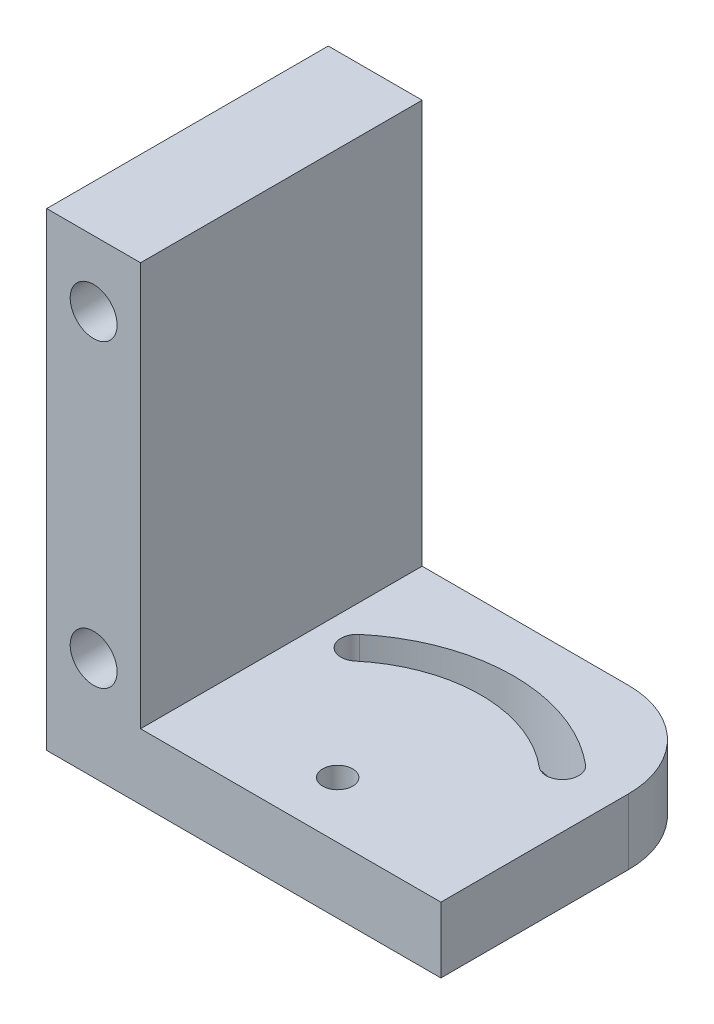
ISO-10303-21;
HEADER;
FILE_DESCRIPTION(('STEP AP214'),'2;1');
FILE_NAME('part.step','',(''),(''),'','','');
FILE_SCHEMA(('AUTOMOTIVE_DESIGN { 1 0 10303 214 1 1 1 1 }'));
ENDSEC;
DATA;
#1=APPLICATION_CONTEXT('core data for automotive mechanical design processes');
#2=APPLICATION_PROTOCOL_DEFINITION('international standard','automotive_design',2000,#1);
#3=PRODUCT_CONTEXT('',#1,'mechanical');
#4=PRODUCT('Part','Part','',(#3));
#5=PRODUCT_RELATED_PRODUCT_CATEGORY('part','',(#4));
#6=PRODUCT_DEFINITION_FORMATION('','',#4);
#7=PRODUCT_DEFINITION_CONTEXT('part definition',#1,'design');
#8=PRODUCT_DEFINITION('design','',#6,#7);
#9=PRODUCT_DEFINITION_SHAPE('','',#8);
#10=(LENGTH_UNIT() NAMED_UNIT(*) SI_UNIT(.MILLI.,.METRE.));
#11=(NAMED_UNIT(*) PLANE_ANGLE_UNIT() SI_UNIT($,.RADIAN.));
#12=(NAMED_UNIT(*) SI_UNIT($,.STERADIAN.) SOLID_ANGLE_UNIT());
#13=UNCERTAINTY_MEASURE_WITH_UNIT(LENGTH_MEASURE(1.E-05),#10,'distance_accuracy_value','');
#14=(GEOMETRIC_REPRESENTATION_CONTEXT(3) GLOBAL_UNCERTAINTY_ASSIGNED_CONTEXT((#13)) GLOBAL_UNIT_ASSIGNED_CONTEXT((#10,
#11,#12)) REPRESENTATION_CONTEXT('',''));
#15=CARTESIAN_POINT('',(0.,0.,0.));
#16=DIRECTION('',(0.,0.,1.));
#17=DIRECTION('',(1.,0.,0.));
#18=AXIS2_PLACEMENT_3D('',#15,#16,#17);
#19=CARTESIAN_POINT('',(0.,7.,0.));
#20=DIRECTION('',(0.,1.,0.));
#21=DIRECTION('',(0.,0.,1.));
#22=AXIS2_PLACEMENT_3D('',#19,#20,#21);
#23=PLANE('',#22);
#24=CARTESIAN_POINT('',(1.70652871400701,7.,15.1316701728416));
#25=DIRECTION('',(0.,1.,0.));
#26=DIRECTION('',(0.,0.,1.));
#27=AXIS2_PLACEMENT_3D('',#24,#25,#26);
#28=CIRCLE('',#27,1.6);
#29=CARTESIAN_POINT('',(1.70652871400701,7.,16.7316701728416));
#30=VERTEX_POINT('',#29);
#31=EDGE_CURVE('E172',#30,#30,#28,.T.);
#32=ORIENTED_EDGE('',*,*,#31,.F.);
#33=EDGE_LOOP('',(#32));
#34=FACE_BOUND('',#33,.T.);
#35=CARTESIAN_POINT('',(-9.22086065066418,7.,2.10891463981895));
#36=DIRECTION('',(0.,1.,0.));
#37=DIRECTION('',(0.,0.,1.));
#38=AXIS2_PLACEMENT_3D('',#35,#36,#37);
#39=CIRCLE('',#38,1.75);
#40=CARTESIAN_POINT('',(-10.3457389676156,7.,0.768336864360739));
#41=VERTEX_POINT('',#40);
#42=CARTESIAN_POINT('',(-8.09598233371273,7.,3.44949241527716));
#43=VERTEX_POINT('',#42);
#44=EDGE_CURVE('E176',#41,#43,#39,.T.);
#45=ORIENTED_EDGE('',*,*,#44,.F.);
#46=CARTESIAN_POINT('',(1.70652871400701,7.,15.1316701728416));
#47=DIRECTION('',(0.,1.,0.));
#48=DIRECTION('',(0.,0.,1.));
#49=AXIS2_PLACEMENT_3D('',#46,#47,#48);
#50=CIRCLE('',#49,18.75);
#51=CARTESIAN_POINT('',(13.7587963956295,7.,0.768336864360656));
#52=VERTEX_POINT('',#51);
#53=EDGE_CURVE('E180',#52,#41,#50,.T.);
#54=ORIENTED_EDGE('',*,*,#53,.F.);
#55=CARTESIAN_POINT('',(12.6339180786781,7.,2.10891463981888));
#56=DIRECTION('',(0.,1.,0.));
#57=DIRECTION('',(0.,0.,1.));
#58=AXIS2_PLACEMENT_3D('',#55,#56,#57);
#59=CIRCLE('',#58,1.75);
#60=CARTESIAN_POINT('',(11.5090397617267,7.,3.44949241527709));
#61=VERTEX_POINT('',#60);
#62=EDGE_CURVE('E184',#61,#52,#59,.T.);
#63=ORIENTED_EDGE('',*,*,#62,.F.);
#64=CARTESIAN_POINT('',(1.70652871400701,7.,15.1316701728416));
#65=DIRECTION('',(0.,1.,0.));
#66=DIRECTION('',(0.,0.,1.));
#67=AXIS2_PLACEMENT_3D('',#64,#65,#66);
#68=CIRCLE('',#67,15.25);
#69=EDGE_CURVE('E188',#61,#43,#68,.T.);
#70=ORIENTED_EDGE('',*,*,#69,.T.);
#71=EDGE_LOOP('',(#45,#54,#63,#70));
#72=FACE_BOUND('',#71,.T.);
#73=DIRECTION('',(1.,0.,0.));
#74=VECTOR('',#73,1.);
#75=CARTESIAN_POINT('',(0.,7.,-8.86832982715844));
#76=LINE('',#75,#74);
#77=CARTESIAN_POINT('',(-13.293471285993,7.,-8.86832982715844));
#78=VERTEX_POINT('',#77);
#79=CARTESIAN_POINT('',(8.70652871400701,7.,-8.86832982715844));
#80=VERTEX_POINT('',#79);
#81=EDGE_CURVE('E61',#78,#80,#76,.T.);
#82=ORIENTED_EDGE('',*,*,#81,.F.);
#83=DIRECTION('',(0.,0.,1.));
#84=VECTOR('',#83,1.);
#85=CARTESIAN_POINT('',(-13.293471285993,7.,0.));
#86=LINE('',#85,#84);
#87=CARTESIAN_POINT('',(-13.293471285993,7.,21.1316701728416));
#88=VERTEX_POINT('',#87);
#89=EDGE_CURVE('E65',#78,#88,#86,.T.);
#90=ORIENTED_EDGE('',*,*,#89,.T.);
#91=DIRECTION('',(1.,0.,0.));
#92=VECTOR('',#91,1.);
#93=CARTESIAN_POINT('',(0.,7.,21.1316701728416));
#94=LINE('',#93,#92);
#95=CARTESIAN_POINT('',(18.706528714007,7.,21.1316701728416));
#96=VERTEX_POINT('',#95);
#97=EDGE_CURVE('E151',#88,#96,#94,.T.);
#98=ORIENTED_EDGE('',*,*,#97,.T.);
#99=DIRECTION('',(0.,0.,-1.));
#100=VECTOR('',#99,1.);
#101=CARTESIAN_POINT('',(18.706528714007,7.,0.));
#102=LINE('',#101,#100);
#103=CARTESIAN_POINT('',(18.706528714007,7.,1.13167017284157));
#104=VERTEX_POINT('',#103);
#105=EDGE_CURVE('E163',#96,#104,#102,.T.);
#106=ORIENTED_EDGE('',*,*,#105,.T.);
#107=CARTESIAN_POINT('',(8.70652871400701,7.,1.13167017284157));
#108=DIRECTION('',(0.,1.,0.));
#109=DIRECTION('',(0.,0.,1.));
#110=AXIS2_PLACEMENT_3D('',#107,#108,#109);
#111=CIRCLE('',#110,10.);
#112=EDGE_CURVE('E167',#104,#80,#111,.T.);
#113=ORIENTED_EDGE('',*,*,#112,.T.);
#114=EDGE_LOOP('',(#82,#90,#98,#106,#113));
#115=FACE_BOUND('',#114,.T.);
#116=ADVANCED_FACE('F43',(#34,#72,#115),#23,.T.);
#117=CARTESIAN_POINT('',(-9.22086065066418,7.,2.10891463981895));
#118=DIRECTION('',(0.,-1.,0.));
#119=DIRECTION('',(0.,0.,-1.));
#120=AXIS2_PLACEMENT_3D('',#117,#118,#119);
#121=CYLINDRICAL_SURFACE('',#120,1.75);
#122=CARTESIAN_POINT('',(-9.22086065066418,0.,2.10891463981895));
#123=DIRECTION('',(0.,1.,0.));
#124=DIRECTION('',(0.,0.,1.));
#125=AXIS2_PLACEMENT_3D('',#122,#123,#124);
#126=CIRCLE('',#125,1.75);
#127=CARTESIAN_POINT('',(-10.3457389676156,0.,0.768336864360739));
#128=VERTEX_POINT('',#127);
#129=CARTESIAN_POINT('',(-8.09598233371273,0.,3.44949241527716));
#130=VERTEX_POINT('',#129);
#131=EDGE_CURVE('E211',#128,#130,#126,.T.);
#132=ORIENTED_EDGE('',*,*,#131,.F.);
#133=DIRECTION('',(0.,-1.,0.));
#134=VECTOR('',#133,1.);
#135=CARTESIAN_POINT('',(-10.3457389676156,7.,0.768336864360739));
#136=LINE('',#135,#134);
#137=EDGE_CURVE('E11',#41,#128,#136,.T.);
#138=ORIENTED_EDGE('',*,*,#137,.F.);
#139=ORIENTED_EDGE('',*,*,#44,.T.);
#140=DIRECTION('',(0.,-1.,0.));
#141=VECTOR('',#140,1.);
#142=CARTESIAN_POINT('',(-8.09598233371273,7.,3.44949241527716));
#143=LINE('',#142,#141);
#144=EDGE_CURVE('E226',#43,#130,#143,.T.);
#145=ORIENTED_EDGE('',*,*,#144,.T.);
#146=EDGE_LOOP('',(#132,#138,#139,#145));
#147=FACE_BOUND('',#146,.T.);
#148=ADVANCED_FACE('F266',(#147),#121,.F.);
#149=CARTESIAN_POINT('',(1.70652871400701,7.,15.1316701728416));
#150=DIRECTION('',(0.,-1.,0.));
#151=DIRECTION('',(0.,0.,-1.));
#152=AXIS2_PLACEMENT_3D('',#149,#150,#151);
#153=CYLINDRICAL_SURFACE('',#152,18.75);
#154=CARTESIAN_POINT('',(1.70652871400701,0.,15.1316701728416));
#155=DIRECTION('',(0.,1.,0.));
#156=DIRECTION('',(0.,0.,1.));
#157=AXIS2_PLACEMENT_3D('',#154,#155,#156);
#158=CIRCLE('',#157,18.75);
#159=CARTESIAN_POINT('',(13.7587963956295,0.,0.768336864360656));
#160=VERTEX_POINT('',#159);
#161=EDGE_CURVE('E215',#160,#128,#158,.T.);
#162=ORIENTED_EDGE('',*,*,#161,.F.);
#163=DIRECTION('',(0.,-1.,0.));
#164=VECTOR('',#163,1.);
#165=CARTESIAN_POINT('',(13.7587963956295,7.,0.768336864360656));
#166=LINE('',#165,#164);
#167=EDGE_CURVE('E53',#52,#160,#166,.T.);
#168=ORIENTED_EDGE('',*,*,#167,.F.);
#169=ORIENTED_EDGE('',*,*,#53,.T.);
#170=ORIENTED_EDGE('',*,*,#137,.T.);
#171=EDGE_LOOP('',(#162,#168,#169,#170));
#172=FACE_BOUND('',#171,.T.);
#173=ADVANCED_FACE('F272',(#172),#153,.F.);
#174=CARTESIAN_POINT('',(12.6339180786781,7.,2.10891463981888));
#175=DIRECTION('',(0.,-1.,0.));
#176=DIRECTION('',(0.,0.,-1.));
#177=AXIS2_PLACEMENT_3D('',#174,#175,#176);
#178=CYLINDRICAL_SURFACE('',#177,1.75);
#179=CARTESIAN_POINT('',(12.6339180786781,0.,2.10891463981888));
#180=DIRECTION('',(0.,1.,0.));
#181=DIRECTION('',(0.,0.,1.));
#182=AXIS2_PLACEMENT_3D('',#179,#180,#181);
#183=CIRCLE('',#182,1.75);
#184=CARTESIAN_POINT('',(11.5090397617267,0.,3.44949241527709));
#185=VERTEX_POINT('',#184);
#186=EDGE_CURVE('E219',#185,#160,#183,.T.);
#187=ORIENTED_EDGE('',*,*,#186,.F.);
#188=DIRECTION('',(0.,-1.,0.));
#189=VECTOR('',#188,1.);
#190=CARTESIAN_POINT('',(11.5090397617267,7.,3.44949241527709));
#191=LINE('',#190,#189);
#192=EDGE_CURVE('E229',#61,#185,#191,.T.);
#193=ORIENTED_EDGE('',*,*,#192,.F.);
#194=ORIENTED_EDGE('',*,*,#62,.T.);
#195=ORIENTED_EDGE('',*,*,#167,.T.);
#196=EDGE_LOOP('',(#187,#193,#194,#195));
#197=FACE_BOUND('',#196,.T.);
#198=ADVANCED_FACE('F287',(#197),#178,.F.);
#199=CARTESIAN_POINT('',(0.,7.,21.1316701728416));
#200=DIRECTION('',(0.,0.,-1.));
#201=DIRECTION('',(-1.,0.,0.));
#202=AXIS2_PLACEMENT_3D('',#199,#200,#201);
#203=PLANE('',#202);
#204=CARTESIAN_POINT('',(-18.293471285993,43.,21.1316701728416));
#205=DIRECTION('',(0.,0.,-1.));
#206=DIRECTION('',(-1.,0.,0.));
#207=AXIS2_PLACEMENT_3D('',#204,#205,#206);
#208=CIRCLE('',#207,2.5);
#209=CARTESIAN_POINT('',(-20.793471285993,43.,21.1316701728416));
#210=VERTEX_POINT('',#209);
#211=EDGE_CURVE('E148',#210,#210,#208,.T.);
#212=ORIENTED_EDGE('',*,*,#211,.T.);
#213=EDGE_LOOP('',(#212));
#214=FACE_BOUND('',#213,.T.);
#215=CARTESIAN_POINT('',(-18.293471285993,11.,21.1316701728416));
#216=DIRECTION('',(0.,0.,-1.));
#217=DIRECTION('',(-1.,0.,0.));
#218=AXIS2_PLACEMENT_3D('',#215,#216,#217);
#219=CIRCLE('',#218,2.5);
#220=CARTESIAN_POINT('',(-20.793471285993,11.,21.1316701728416));
#221=VERTEX_POINT('',#220);
#222=EDGE_CURVE('E317',#221,#221,#219,.T.);
#223=ORIENTED_EDGE('',*,*,#222,.T.);
#224=EDGE_LOOP('',(#223));
#225=FACE_BOUND('',#224,.T.);
#226=DIRECTION('',(1.,0.,0.));
#227=VECTOR('',#226,1.);
#228=CARTESIAN_POINT('',(0.,0.,21.1316701728416));
#229=LINE('',#228,#227);
#230=CARTESIAN_POINT('',(-23.293471285993,0.,21.1316701728416));
#231=VERTEX_POINT('',#230);
#232=CARTESIAN_POINT('',(18.706528714007,0.,21.1316701728416));
#233=VERTEX_POINT('',#232);
#234=EDGE_CURVE('E156',#231,#233,#229,.T.);
#235=ORIENTED_EDGE('',*,*,#234,.T.);
#236=DIRECTION('',(0.,-1.,0.));
#237=VECTOR('',#236,1.);
#238=CARTESIAN_POINT('',(18.706528714007,7.,21.1316701728416));
#239=LINE('',#238,#237);
#240=EDGE_CURVE('E47',#96,#233,#239,.T.);
#241=ORIENTED_EDGE('',*,*,#240,.F.);
#242=ORIENTED_EDGE('',*,*,#97,.F.);
#243=DIRECTION('',(0.,-1.,0.));
#244=VECTOR('',#243,1.);
#245=CARTESIAN_POINT('',(-13.293471285993,50.,21.1316701728416));
#246=LINE('',#245,#244);
#247=CARTESIAN_POINT('',(-13.293471285993,50.,21.1316701728416));
#248=VERTEX_POINT('',#247);
#249=EDGE_CURVE('E130',#248,#88,#246,.T.);
#250=ORIENTED_EDGE('',*,*,#249,.F.);
#251=DIRECTION('',(1.,0.,0.));
#252=VECTOR('',#251,1.);
#253=CARTESIAN_POINT('',(0.,50.,21.1316701728416));
#254=LINE('',#253,#252);
#255=CARTESIAN_POINT('',(-23.293471285993,50.,21.1316701728416));
#256=VERTEX_POINT('',#255);
#257=EDGE_CURVE('E138',#256,#248,#254,.T.);
#258=ORIENTED_EDGE('',*,*,#257,.F.);
#259=DIRECTION('',(0.,-1.,0.));
#260=VECTOR('',#259,1.);
#261=CARTESIAN_POINT('',(-23.293471285993,7.,21.1316701728416));
#262=LINE('',#261,#260);
#263=EDGE_CURVE('E191',#256,#231,#262,.T.);
#264=ORIENTED_EDGE('',*,*,#263,.T.);
#265=EDGE_LOOP('',(#235,#241,#242,#250,#258,#264));
#266=FACE_BOUND('',#265,.T.);
#267=ADVANCED_FACE('F45',(#214,#225,#266),#203,.F.);
#268=CARTESIAN_POINT('',(18.706528714007,7.,0.));
#269=DIRECTION('',(-1.,0.,0.));
#270=DIRECTION('',(0.,0.,1.));
#271=AXIS2_PLACEMENT_3D('',#268,#269,#270);
#272=PLANE('',#271);
#273=DIRECTION('',(0.,0.,-1.));
#274=VECTOR('',#273,1.);
#275=CARTESIAN_POINT('',(18.706528714007,0.,0.));
#276=LINE('',#275,#274);
#277=CARTESIAN_POINT('',(18.706528714007,0.,1.13167017284157));
#278=VERTEX_POINT('',#277);
#279=EDGE_CURVE('E194',#233,#278,#276,.T.);
#280=ORIENTED_EDGE('',*,*,#279,.T.);
#281=DIRECTION('',(0.,-1.,0.));
#282=VECTOR('',#281,1.);
#283=CARTESIAN_POINT('',(18.706528714007,7.,1.13167017284157));
#284=LINE('',#283,#282);
#285=EDGE_CURVE('E242',#104,#278,#284,.T.);
#286=ORIENTED_EDGE('',*,*,#285,.F.);
#287=ORIENTED_EDGE('',*,*,#105,.F.);
#288=ORIENTED_EDGE('',*,*,#240,.T.);
#289=EDGE_LOOP('',(#280,#286,#287,#288));
#290=FACE_BOUND('',#289,.T.);
#291=ADVANCED_FACE('F253',(#290),#272,.F.);
#292=CARTESIAN_POINT('',(8.70652871400701,7.,1.13167017284157));
#293=DIRECTION('',(0.,-1.,0.));
#294=DIRECTION('',(0.,0.,-1.));
#295=AXIS2_PLACEMENT_3D('',#292,#293,#294);
#296=CYLINDRICAL_SURFACE('',#295,10.);
#297=CARTESIAN_POINT('',(8.70652871400701,0.,1.13167017284157));
#298=DIRECTION('',(0.,1.,0.));
#299=DIRECTION('',(0.,0.,1.));
#300=AXIS2_PLACEMENT_3D('',#297,#298,#299);
#301=CIRCLE('',#300,10.);
#302=CARTESIAN_POINT('',(8.70652871400701,0.,-8.86832982715844));
#303=VERTEX_POINT('',#302);
#304=EDGE_CURVE('E197',#278,#303,#301,.T.);
#305=ORIENTED_EDGE('',*,*,#304,.T.);
#306=DIRECTION('',(0.,-1.,0.));
#307=VECTOR('',#306,1.);
#308=CARTESIAN_POINT('',(8.70652871400701,7.,-8.86832982715844));
#309=LINE('',#308,#307);
#310=EDGE_CURVE('E239',#80,#303,#309,.T.);
#311=ORIENTED_EDGE('',*,*,#310,.F.);
#312=ORIENTED_EDGE('',*,*,#112,.F.);
#313=ORIENTED_EDGE('',*,*,#285,.T.);
#314=EDGE_LOOP('',(#305,#311,#312,#313));
#315=FACE_BOUND('',#314,.T.);
#316=ADVANCED_FACE('F262',(#315),#296,.T.);
#317=CARTESIAN_POINT('',(0.,7.,-8.86832982715844));
#318=DIRECTION('',(0.,0.,-1.));
#319=DIRECTION('',(-1.,0.,0.));
#320=AXIS2_PLACEMENT_3D('',#317,#318,#319);
#321=PLANE('',#320);
#322=CARTESIAN_POINT('',(-18.293471285993,43.,-8.86832982715844));
#323=DIRECTION('',(0.,0.,-1.));
#324=DIRECTION('',(-1.,0.,0.));
#325=AXIS2_PLACEMENT_3D('',#322,#323,#324);
#326=CIRCLE('',#325,2.5);
#327=CARTESIAN_POINT('',(-20.793471285993,43.,-8.86832982715844));
#328=VERTEX_POINT('',#327);
#329=EDGE_CURVE('E320',#328,#328,#326,.T.);
#330=ORIENTED_EDGE('',*,*,#329,.F.);
#331=EDGE_LOOP('',(#330));
#332=FACE_BOUND('',#331,.T.);
#333=CARTESIAN_POINT('',(-18.293471285993,11.,-8.86832982715844));
#334=DIRECTION('',(0.,0.,-1.));
#335=DIRECTION('',(-1.,0.,0.));
#336=AXIS2_PLACEMENT_3D('',#333,#334,#335);
#337=CIRCLE('',#336,2.5);
#338=CARTESIAN_POINT('',(-20.793471285993,11.,-8.86832982715844));
#339=VERTEX_POINT('',#338);
#340=EDGE_CURVE('E321',#339,#339,#337,.T.);
#341=ORIENTED_EDGE('',*,*,#340,.F.);
#342=EDGE_LOOP('',(#341));
#343=FACE_BOUND('',#342,.T.);
#344=DIRECTION('',(0.,-1.,0.));
#345=VECTOR('',#344,1.);
#346=CARTESIAN_POINT('',(-13.293471285993,50.,-8.86832982715844));
#347=LINE('',#346,#345);
#348=CARTESIAN_POINT('',(-13.293471285993,50.,-8.86832982715844));
#349=VERTEX_POINT('',#348);
#350=EDGE_CURVE('E132',#349,#78,#347,.T.);
#351=ORIENTED_EDGE('',*,*,#350,.T.);
#352=ORIENTED_EDGE('',*,*,#81,.T.);
#353=ORIENTED_EDGE('',*,*,#310,.T.);
#354=DIRECTION('',(1.,0.,0.));
#355=VECTOR('',#354,1.);
#356=CARTESIAN_POINT('',(0.,0.,-8.86832982715844));
#357=LINE('',#356,#355);
#358=CARTESIAN_POINT('',(-23.293471285993,0.,-8.86832982715844));
#359=VERTEX_POINT('',#358);
#360=EDGE_CURVE('E201',#359,#303,#357,.T.);
#361=ORIENTED_EDGE('',*,*,#360,.F.);
#362=DIRECTION('',(0.,-1.,0.));
#363=VECTOR('',#362,1.);
#364=CARTESIAN_POINT('',(-23.293471285993,7.,-8.86832982715844));
#365=LINE('',#364,#363);
#366=CARTESIAN_POINT('',(-23.293471285993,50.,-8.86832982715844));
#367=VERTEX_POINT('',#366);
#368=EDGE_CURVE('E236',#367,#359,#365,.T.);
#369=ORIENTED_EDGE('',*,*,#368,.F.);
#370=DIRECTION('',(1.,0.,0.));
#371=VECTOR('',#370,1.);
#372=CARTESIAN_POINT('',(0.,50.,-8.86832982715844));
#373=LINE('',#372,#371);
#374=EDGE_CURVE('E137',#367,#349,#373,.T.);
#375=ORIENTED_EDGE('',*,*,#374,.T.);
#376=EDGE_LOOP('',(#351,#352,#353,#361,#369,#375));
#377=FACE_BOUND('',#376,.T.);
#378=ADVANCED_FACE('F264',(#332,#343,#377),#321,.T.);
#379=CARTESIAN_POINT('',(1.70652871400701,7.,15.1316701728416));
#380=DIRECTION('',(0.,-1.,0.));
#381=DIRECTION('',(0.,0.,-1.));
#382=AXIS2_PLACEMENT_3D('',#379,#380,#381);
#383=CYLINDRICAL_SURFACE('',#382,1.6);
#384=ORIENTED_EDGE('',*,*,#31,.T.);
#385=EDGE_LOOP('',(#384));
#386=FACE_BOUND('',#385,.T.);
#387=CARTESIAN_POINT('',(1.70652871400701,0.,15.1316701728416));
#388=DIRECTION('',(0.,1.,0.));
#389=DIRECTION('',(0.,0.,1.));
#390=AXIS2_PLACEMENT_3D('',#387,#388,#389);
#391=CIRCLE('',#390,1.6);
#392=CARTESIAN_POINT('',(1.70652871400701,0.,16.7316701728416));
#393=VERTEX_POINT('',#392);
#394=EDGE_CURVE('E207',#393,#393,#391,.T.);
#395=ORIENTED_EDGE('',*,*,#394,.F.);
#396=EDGE_LOOP('',(#395));
#397=FACE_BOUND('',#396,.T.);
#398=ADVANCED_FACE('F294',(#386,#397),#383,.F.);
#399=CARTESIAN_POINT('',(-23.293471285993,7.,0.));
#400=DIRECTION('',(1.,0.,0.));
#401=DIRECTION('',(0.,0.,-1.));
#402=AXIS2_PLACEMENT_3D('',#399,#400,#401);
#403=PLANE('',#402);
#404=DIRECTION('',(0.,0.,1.));
#405=VECTOR('',#404,1.);
#406=CARTESIAN_POINT('',(-23.293471285993,0.,0.));
#407=LINE('',#406,#405);
#408=EDGE_CURVE('E204',#359,#231,#407,.T.);
#409=ORIENTED_EDGE('',*,*,#408,.T.);
#410=ORIENTED_EDGE('',*,*,#263,.F.);
#411=DIRECTION('',(0.,0.,1.));
#412=VECTOR('',#411,1.);
#413=CARTESIAN_POINT('',(-23.293471285993,50.,0.));
#414=LINE('',#413,#412);
#415=EDGE_CURVE('E144',#367,#256,#414,.T.);
#416=ORIENTED_EDGE('',*,*,#415,.F.);
#417=ORIENTED_EDGE('',*,*,#368,.T.);
#418=EDGE_LOOP('',(#409,#410,#416,#417));
#419=FACE_BOUND('',#418,.T.);
#420=ADVANCED_FACE('F285',(#419),#403,.F.);
#421=CARTESIAN_POINT('',(1.70652871400701,7.,15.1316701728416));
#422=DIRECTION('',(0.,-1.,0.));
#423=DIRECTION('',(0.,0.,-1.));
#424=AXIS2_PLACEMENT_3D('',#421,#422,#423);
#425=CYLINDRICAL_SURFACE('',#424,15.25);
#426=CARTESIAN_POINT('',(1.70652871400701,0.,15.1316701728416));
#427=DIRECTION('',(0.,1.,0.));
#428=DIRECTION('',(0.,0.,1.));
#429=AXIS2_PLACEMENT_3D('',#426,#427,#428);
#430=CIRCLE('',#429,15.25);
#431=EDGE_CURVE('E164',#185,#130,#430,.T.);
#432=ORIENTED_EDGE('',*,*,#431,.T.);
#433=ORIENTED_EDGE('',*,*,#144,.F.);
#434=ORIENTED_EDGE('',*,*,#69,.F.);
#435=ORIENTED_EDGE('',*,*,#192,.T.);
#436=EDGE_LOOP('',(#432,#433,#434,#435));
#437=FACE_BOUND('',#436,.T.);
#438=ADVANCED_FACE('F282',(#437),#425,.T.);
#439=CARTESIAN_POINT('',(0.,0.,0.));
#440=DIRECTION('',(0.,1.,0.));
#441=DIRECTION('',(0.,0.,1.));
#442=AXIS2_PLACEMENT_3D('',#439,#440,#441);
#443=PLANE('',#442);
#444=ORIENTED_EDGE('',*,*,#360,.T.);
#445=ORIENTED_EDGE('',*,*,#304,.F.);
#446=ORIENTED_EDGE('',*,*,#279,.F.);
#447=ORIENTED_EDGE('',*,*,#234,.F.);
#448=ORIENTED_EDGE('',*,*,#408,.F.);
#449=EDGE_LOOP('',(#444,#445,#446,#447,#448));
#450=FACE_BOUND('',#449,.T.);
#451=ORIENTED_EDGE('',*,*,#131,.T.);
#452=ORIENTED_EDGE('',*,*,#431,.F.);
#453=ORIENTED_EDGE('',*,*,#186,.T.);
#454=ORIENTED_EDGE('',*,*,#161,.T.);
#455=EDGE_LOOP('',(#451,#452,#453,#454));
#456=FACE_BOUND('',#455,.T.);
#457=ORIENTED_EDGE('',*,*,#394,.T.);
#458=EDGE_LOOP('',(#457));
#459=FACE_BOUND('',#458,.T.);
#460=ADVANCED_FACE('F258',(#450,#456,#459),#443,.F.);
#461=CARTESIAN_POINT('',(-13.293471285993,50.,0.));
#462=DIRECTION('',(-1.,0.,0.));
#463=DIRECTION('',(0.,0.,1.));
#464=AXIS2_PLACEMENT_3D('',#461,#462,#463);
#465=PLANE('',#464);
#466=ORIENTED_EDGE('',*,*,#89,.F.);
#467=ORIENTED_EDGE('',*,*,#350,.F.);
#468=DIRECTION('',(0.,0.,-1.));
#469=VECTOR('',#468,1.);
#470=CARTESIAN_POINT('',(-13.293471285993,50.,0.));
#471=LINE('',#470,#469);
#472=EDGE_CURVE('E126',#248,#349,#471,.T.);
#473=ORIENTED_EDGE('',*,*,#472,.F.);
#474=ORIENTED_EDGE('',*,*,#249,.T.);
#475=EDGE_LOOP('',(#466,#467,#473,#474));
#476=FACE_BOUND('',#475,.T.);
#477=ADVANCED_FACE('F128',(#476),#465,.F.);
#478=CARTESIAN_POINT('',(0.,50.,0.));
#479=DIRECTION('',(0.,1.,0.));
#480=DIRECTION('',(0.,0.,1.));
#481=AXIS2_PLACEMENT_3D('',#478,#479,#480);
#482=PLANE('',#481);
#483=ORIENTED_EDGE('',*,*,#257,.T.);
#484=ORIENTED_EDGE('',*,*,#472,.T.);
#485=ORIENTED_EDGE('',*,*,#374,.F.);
#486=ORIENTED_EDGE('',*,*,#415,.T.);
#487=EDGE_LOOP('',(#483,#484,#485,#486));
#488=FACE_BOUND('',#487,.T.);
#489=ADVANCED_FACE('F142',(#488),#482,.T.);
#490=CARTESIAN_POINT('',(-18.293471285993,11.,21.1316701728416));
#491=DIRECTION('',(0.,0.,-1.));
#492=DIRECTION('',(-1.,0.,0.));
#493=AXIS2_PLACEMENT_3D('',#490,#491,#492);
#494=CYLINDRICAL_SURFACE('',#493,2.5);
#495=CARTESIAN_POINT('',(-20.793471285993,11.,21.1316701728416));
#496=CARTESIAN_POINT('',(-20.793471285993,11.,20.8191701728416));
#497=CARTESIAN_POINT('',(-20.793471285993,11.,20.5066701728416));
#498=CARTESIAN_POINT('',(-20.793471285993,11.,19.8816701728416));
#499=CARTESIAN_POINT('',(-20.793471285993,11.,19.5691701728416));
#500=CARTESIAN_POINT('',(-20.793471285993,11.,18.9441701728416));
#501=CARTESIAN_POINT('',(-20.793471285993,11.,18.6316701728416));
#502=CARTESIAN_POINT('',(-20.793471285993,11.,18.0066701728416));
#503=CARTESIAN_POINT('',(-20.793471285993,11.,17.6941701728416));
#504=CARTESIAN_POINT('',(-20.793471285993,11.,17.0691701728416));
#505=CARTESIAN_POINT('',(-20.793471285993,11.,16.7566701728416));
#506=CARTESIAN_POINT('',(-20.793471285993,11.,16.1316701728416));
#507=CARTESIAN_POINT('',(-20.793471285993,11.,15.8191701728416));
#508=CARTESIAN_POINT('',(-20.793471285993,11.,15.1941701728416));
#509=CARTESIAN_POINT('',(-20.793471285993,11.,14.8816701728416));
#510=CARTESIAN_POINT('',(-20.793471285993,11.,14.2566701728416));
#511=CARTESIAN_POINT('',(-20.793471285993,11.,13.9441701728416));
#512=CARTESIAN_POINT('',(-20.793471285993,11.,13.3191701728416));
#513=CARTESIAN_POINT('',(-20.793471285993,11.,13.0066701728416));
#514=CARTESIAN_POINT('',(-20.793471285993,11.,12.3816701728416));
#515=CARTESIAN_POINT('',(-20.793471285993,11.,12.0691701728416));
#516=CARTESIAN_POINT('',(-20.793471285993,11.,11.4441701728416));
#517=CARTESIAN_POINT('',(-20.793471285993,11.,11.1316701728416));
#518=CARTESIAN_POINT('',(-20.793471285993,11.,10.5066701728416));
#519=CARTESIAN_POINT('',(-20.793471285993,11.,10.1941701728416));
#520=CARTESIAN_POINT('',(-20.793471285993,11.,9.56917017284157));
#521=CARTESIAN_POINT('',(-20.793471285993,11.,9.25667017284156));
#522=CARTESIAN_POINT('',(-20.793471285993,11.,8.63167017284156));
#523=CARTESIAN_POINT('',(-20.793471285993,11.,8.31917017284156));
#524=CARTESIAN_POINT('',(-20.793471285993,11.,7.69417017284156));
#525=CARTESIAN_POINT('',(-20.793471285993,11.,7.38167017284156));
#526=CARTESIAN_POINT('',(-20.793471285993,11.,6.75667017284156));
#527=CARTESIAN_POINT('',(-20.793471285993,11.,6.44417017284156));
#528=CARTESIAN_POINT('',(-20.793471285993,11.,5.81917017284157));
#529=CARTESIAN_POINT('',(-20.793471285993,11.,5.50667017284157));
#530=CARTESIAN_POINT('',(-20.793471285993,11.,4.88167017284157));
#531=CARTESIAN_POINT('',(-20.793471285993,11.,4.56917017284157));
#532=CARTESIAN_POINT('',(-20.793471285993,11.,3.94417017284157));
#533=CARTESIAN_POINT('',(-20.793471285993,11.,3.63167017284157));
#534=CARTESIAN_POINT('',(-20.793471285993,11.,3.00667017284157));
#535=CARTESIAN_POINT('',(-20.793471285993,11.,2.69417017284157));
#536=CARTESIAN_POINT('',(-20.793471285993,11.,2.06917017284157));
#537=CARTESIAN_POINT('',(-20.793471285993,11.,1.75667017284157));
#538=CARTESIAN_POINT('',(-20.793471285993,11.,1.13167017284157));
#539=CARTESIAN_POINT('',(-20.793471285993,11.,0.819170172841565));
#540=CARTESIAN_POINT('',(-20.793471285993,11.,0.194170172841566));
#541=CARTESIAN_POINT('',(-20.793471285993,11.,-0.118329827158434));
#542=CARTESIAN_POINT('',(-20.793471285993,11.,-0.743329827158433));
#543=CARTESIAN_POINT('',(-20.793471285993,11.,-1.05582982715843));
#544=CARTESIAN_POINT('',(-20.793471285993,11.,-1.68082982715843));
#545=CARTESIAN_POINT('',(-20.793471285993,11.,-1.99332982715843));
#546=CARTESIAN_POINT('',(-20.793471285993,11.,-2.61832982715843));
#547=CARTESIAN_POINT('',(-20.793471285993,11.,-2.93082982715843));
#548=CARTESIAN_POINT('',(-20.793471285993,11.,-3.55582982715844));
#549=CARTESIAN_POINT('',(-20.793471285993,11.,-3.86832982715844));
#550=CARTESIAN_POINT('',(-20.793471285993,11.,-4.49332982715844));
#551=CARTESIAN_POINT('',(-20.793471285993,11.,-4.80582982715844));
#552=CARTESIAN_POINT('',(-20.793471285993,11.,-5.43082982715844));
#553=CARTESIAN_POINT('',(-20.793471285993,11.,-5.74332982715844));
#554=CARTESIAN_POINT('',(-20.793471285993,11.,-6.36832982715843));
#555=CARTESIAN_POINT('',(-20.793471285993,11.,-6.68082982715843));
#556=CARTESIAN_POINT('',(-20.793471285993,11.,-7.30582982715844));
#557=CARTESIAN_POINT('',(-20.793471285993,11.,-7.61832982715844));
#558=CARTESIAN_POINT('',(-20.793471285993,11.,-8.24332982715844));
#559=CARTESIAN_POINT('',(-20.793471285993,11.,-8.55582982715844));
#560=CARTESIAN_POINT('',(-20.793471285993,11.,-8.86832982715844));
#561=B_SPLINE_CURVE_WITH_KNOTS('',3,(#495,#496,#497,#498,#499,#500,#501,#502,#503,#504,#505,
#506,#507,#508,#509,#510,#511,#512,#513,#514,#515,#516,#517,#518,#519,#520,#521,#522,#523,#524,
#525,#526,#527,#528,#529,#530,#531,#532,#533,#534,#535,#536,#537,#538,#539,#540,#541,#542,#543,
#544,#545,#546,#547,#548,#549,#550,#551,#552,#553,#554,#555,#556,#557,#558,#559,#560),
.UNSPECIFIED.,.F.,.F.,(4,2,2,2,2,2,2,2,2,2,2,2,2,2,2,2,2,2,2,2,2,2,2,2,2,2,2,2,2,2,2,2,4),(0.,
0.937500000000001,1.875,2.8125,3.75,4.6875,5.625,6.5625,7.5,8.4375,9.375,10.3125,11.25,12.1875,
13.125,14.0625,15.,15.9375,16.875,17.8125,18.75,19.6875,20.625,21.5625,22.5,23.4375,24.375,
25.3125,26.25,27.1875,28.125,29.0625,30.),.UNSPECIFIED.);
#562=EDGE_CURVE('BSEAM336',#221,#339,#561,.T.);
#563=ORIENTED_EDGE('',*,*,#222,.F.);
#564=ORIENTED_EDGE('',*,*,#340,.T.);
#565=ORIENTED_EDGE('',*,*,#562,.T.);
#566=ORIENTED_EDGE('',*,*,#562,.F.);
#567=EDGE_LOOP('',(#563,#565,#564,#566));
#568=FACE_BOUND('',#567,.T.);
#569=ADVANCED_FACE('F336',(#568),#494,.F.);
#570=CARTESIAN_POINT('',(-18.293471285993,43.,21.1316701728416));
#571=DIRECTION('',(0.,0.,-1.));
#572=DIRECTION('',(-1.,0.,0.));
#573=AXIS2_PLACEMENT_3D('',#570,#571,#572);
#574=CYLINDRICAL_SURFACE('',#573,2.5);
#575=CARTESIAN_POINT('',(-20.793471285993,43.,21.1316701728416));
#576=CARTESIAN_POINT('',(-20.793471285993,43.,20.8191701728416));
#577=CARTESIAN_POINT('',(-20.793471285993,43.,20.5066701728416));
#578=CARTESIAN_POINT('',(-20.793471285993,43.,19.8816701728416));
#579=CARTESIAN_POINT('',(-20.793471285993,43.,19.5691701728416));
#580=CARTESIAN_POINT('',(-20.793471285993,43.,18.9441701728416));
#581=CARTESIAN_POINT('',(-20.793471285993,43.,18.6316701728416));
#582=CARTESIAN_POINT('',(-20.793471285993,43.,18.0066701728416));
#583=CARTESIAN_POINT('',(-20.793471285993,43.,17.6941701728416));
#584=CARTESIAN_POINT('',(-20.793471285993,43.,17.0691701728416));
#585=CARTESIAN_POINT('',(-20.793471285993,43.,16.7566701728416));
#586=CARTESIAN_POINT('',(-20.793471285993,43.,16.1316701728416));
#587=CARTESIAN_POINT('',(-20.793471285993,43.,15.8191701728416));
#588=CARTESIAN_POINT('',(-20.793471285993,43.,15.1941701728416));
#589=CARTESIAN_POINT('',(-20.793471285993,43.,14.8816701728416));
#590=CARTESIAN_POINT('',(-20.793471285993,43.,14.2566701728416));
#591=CARTESIAN_POINT('',(-20.793471285993,43.,13.9441701728416));
#592=CARTESIAN_POINT('',(-20.793471285993,43.,13.3191701728416));
#593=CARTESIAN_POINT('',(-20.793471285993,43.,13.0066701728416));
#594=CARTESIAN_POINT('',(-20.793471285993,43.,12.3816701728416));
#595=CARTESIAN_POINT('',(-20.793471285993,43.,12.0691701728416));
#596=CARTESIAN_POINT('',(-20.793471285993,43.,11.4441701728416));
#597=CARTESIAN_POINT('',(-20.793471285993,43.,11.1316701728416));
#598=CARTESIAN_POINT('',(-20.793471285993,43.,10.5066701728416));
#599=CARTESIAN_POINT('',(-20.793471285993,43.,10.1941701728416));
#600=CARTESIAN_POINT('',(-20.793471285993,43.,9.56917017284157));
#601=CARTESIAN_POINT('',(-20.793471285993,43.,9.25667017284156));
#602=CARTESIAN_POINT('',(-20.793471285993,43.,8.63167017284156));
#603=CARTESIAN_POINT('',(-20.793471285993,43.,8.31917017284156));
#604=CARTESIAN_POINT('',(-20.793471285993,43.,7.69417017284156));
#605=CARTESIAN_POINT('',(-20.793471285993,43.,7.38167017284156));
#606=CARTESIAN_POINT('',(-20.793471285993,43.,6.75667017284156));
#607=CARTESIAN_POINT('',(-20.793471285993,43.,6.44417017284156));
#608=CARTESIAN_POINT('',(-20.793471285993,43.,5.81917017284157));
#609=CARTESIAN_POINT('',(-20.793471285993,43.,5.50667017284157));
#610=CARTESIAN_POINT('',(-20.793471285993,43.,4.88167017284157));
#611=CARTESIAN_POINT('',(-20.793471285993,43.,4.56917017284157));
#612=CARTESIAN_POINT('',(-20.793471285993,43.,3.94417017284157));
#613=CARTESIAN_POINT('',(-20.793471285993,43.,3.63167017284157));
#614=CARTESIAN_POINT('',(-20.793471285993,43.,3.00667017284157));
#615=CARTESIAN_POINT('',(-20.793471285993,43.,2.69417017284157));
#616=CARTESIAN_POINT('',(-20.793471285993,43.,2.06917017284157));
#617=CARTESIAN_POINT('',(-20.793471285993,43.,1.75667017284157));
#618=CARTESIAN_POINT('',(-20.793471285993,43.,1.13167017284157));
#619=CARTESIAN_POINT('',(-20.793471285993,43.,0.819170172841565));
#620=CARTESIAN_POINT('',(-20.793471285993,43.,0.194170172841566));
#621=CARTESIAN_POINT('',(-20.793471285993,43.,-0.118329827158434));
#622=CARTESIAN_POINT('',(-20.793471285993,43.,-0.743329827158433));
#623=CARTESIAN_POINT('',(-20.793471285993,43.,-1.05582982715843));
#624=CARTESIAN_POINT('',(-20.793471285993,43.,-1.68082982715843));
#625=CARTESIAN_POINT('',(-20.793471285993,43.,-1.99332982715843));
#626=CARTESIAN_POINT('',(-20.793471285993,43.,-2.61832982715843));
#627=CARTESIAN_POINT('',(-20.793471285993,43.,-2.93082982715843));
#628=CARTESIAN_POINT('',(-20.793471285993,43.,-3.55582982715844));
#629=CARTESIAN_POINT('',(-20.793471285993,43.,-3.86832982715844));
#630=CARTESIAN_POINT('',(-20.793471285993,43.,-4.49332982715844));
#631=CARTESIAN_POINT('',(-20.793471285993,43.,-4.80582982715844));
#632=CARTESIAN_POINT('',(-20.793471285993,43.,-5.43082982715844));
#633=CARTESIAN_POINT('',(-20.793471285993,43.,-5.74332982715844));
#634=CARTESIAN_POINT('',(-20.793471285993,43.,-6.36832982715843));
#635=CARTESIAN_POINT('',(-20.793471285993,43.,-6.68082982715843));
#636=CARTESIAN_POINT('',(-20.793471285993,43.,-7.30582982715844));
#637=CARTESIAN_POINT('',(-20.793471285993,43.,-7.61832982715844));
#638=CARTESIAN_POINT('',(-20.793471285993,43.,-8.24332982715844));
#639=CARTESIAN_POINT('',(-20.793471285993,43.,-8.55582982715844));
#640=CARTESIAN_POINT('',(-20.793471285993,43.,-8.86832982715844));
#641=B_SPLINE_CURVE_WITH_KNOTS('',3,(#575,#576,#577,#578,#579,#580,#581,#582,#583,#584,#585,
#586,#587,#588,#589,#590,#591,#592,#593,#594,#595,#596,#597,#598,#599,#600,#601,#602,#603,#604,
#605,#606,#607,#608,#609,#610,#611,#612,#613,#614,#615,#616,#617,#618,#619,#620,#621,#622,#623,
#624,#625,#626,#627,#628,#629,#630,#631,#632,#633,#634,#635,#636,#637,#638,#639,#640),
.UNSPECIFIED.,.F.,.F.,(4,2,2,2,2,2,2,2,2,2,2,2,2,2,2,2,2,2,2,2,2,2,2,2,2,2,2,2,2,2,2,2,4),(0.,
0.937500000000001,1.875,2.8125,3.75,4.6875,5.625,6.5625,7.5,8.4375,9.375,10.3125,11.25,12.1875,
13.125,14.0625,15.,15.9375,16.875,17.8125,18.75,19.6875,20.625,21.5625,22.5,23.4375,24.375,
25.3125,26.25,27.1875,28.125,29.0625,30.),.UNSPECIFIED.);
#642=EDGE_CURVE('BSEAM339',#210,#328,#641,.T.);
#643=ORIENTED_EDGE('',*,*,#211,.F.);
#644=ORIENTED_EDGE('',*,*,#329,.T.);
#645=ORIENTED_EDGE('',*,*,#642,.T.);
#646=ORIENTED_EDGE('',*,*,#642,.F.);
#647=EDGE_LOOP('',(#643,#645,#644,#646));
#648=FACE_BOUND('',#647,.T.);
#649=ADVANCED_FACE('F339',(#648),#574,.F.);
#650=CLOSED_SHELL('',(#116,#148,#173,#198,#267,#291,#316,#378,#398,#420,#438,#460,#477,#489,
#569,#649));
#651=MANIFOLD_SOLID_BREP('B2',#650);
#652=ADVANCED_BREP_SHAPE_REPRESENTATION('',(#18,#651),#14);
#653=SHAPE_DEFINITION_REPRESENTATION(#9,#652);
ENDSEC;
END-ISO-10303-21;
